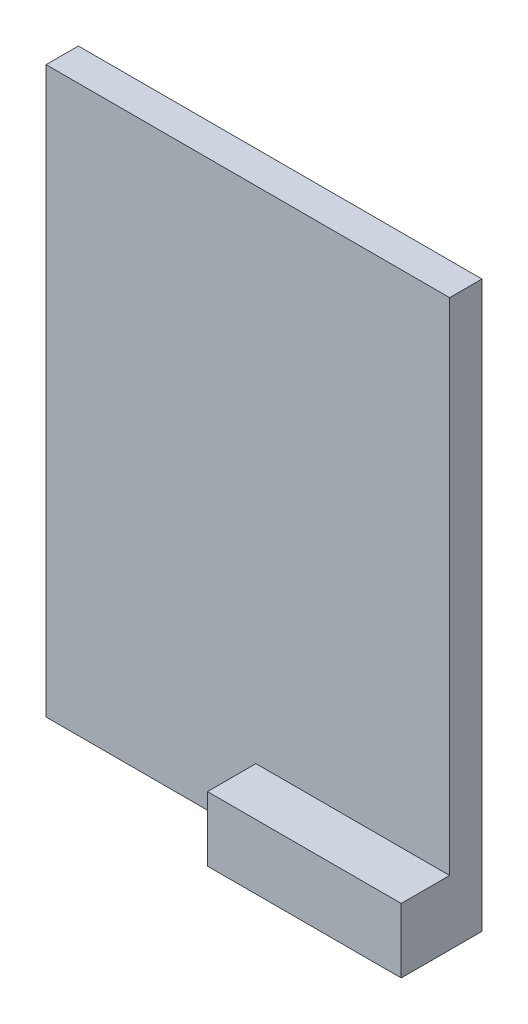
ISO-10303-21;
HEADER;
FILE_DESCRIPTION(('STEP AP214'),'2;1');
FILE_NAME('part.step','',(''),(''),'','','');
FILE_SCHEMA(('AUTOMOTIVE_DESIGN { 1 0 10303 214 1 1 1 1 }'));
ENDSEC;
DATA;
#1=APPLICATION_CONTEXT('core data for automotive mechanical design processes');
#2=APPLICATION_PROTOCOL_DEFINITION('international standard','automotive_design',2000,#1);
#3=PRODUCT_CONTEXT('',#1,'mechanical');
#4=PRODUCT('Part','Part','',(#3));
#5=PRODUCT_RELATED_PRODUCT_CATEGORY('part','',(#4));
#6=PRODUCT_DEFINITION_FORMATION('','',#4);
#7=PRODUCT_DEFINITION_CONTEXT('part definition',#1,'design');
#8=PRODUCT_DEFINITION('design','',#6,#7);
#9=PRODUCT_DEFINITION_SHAPE('','',#8);
#10=(LENGTH_UNIT() NAMED_UNIT(*) SI_UNIT(.MILLI.,.METRE.));
#11=(NAMED_UNIT(*) PLANE_ANGLE_UNIT() SI_UNIT($,.RADIAN.));
#12=(NAMED_UNIT(*) SI_UNIT($,.STERADIAN.) SOLID_ANGLE_UNIT());
#13=UNCERTAINTY_MEASURE_WITH_UNIT(LENGTH_MEASURE(1.E-05),#10,'distance_accuracy_value','');
#14=(GEOMETRIC_REPRESENTATION_CONTEXT(3) GLOBAL_UNCERTAINTY_ASSIGNED_CONTEXT((#13)) GLOBAL_UNIT_ASSIGNED_CONTEXT((#10,
#11,#12)) REPRESENTATION_CONTEXT('',''));
#15=CARTESIAN_POINT('',(0.,0.,0.));
#16=DIRECTION('',(0.,0.,1.));
#17=DIRECTION('',(1.,0.,0.));
#18=AXIS2_PLACEMENT_3D('',#15,#16,#17);
#19=CARTESIAN_POINT('',(-40.6525668835864,11.9444444444444,2.));
#20=DIRECTION('',(1.,0.,0.));
#21=DIRECTION('',(0.,1.,0.));
#22=AXIS2_PLACEMENT_3D('',#19,#20,#21);
#23=PLANE('',#22);
#24=DIRECTION('',(0.,-1.,0.));
#25=VECTOR('',#24,1.);
#26=CARTESIAN_POINT('',(-40.6525668835864,11.9444444444444,0.));
#27=LINE('',#26,#25);
#28=CARTESIAN_POINT('',(-40.6525668835864,11.9444444444444,0.));
#29=VERTEX_POINT('',#28);
#30=CARTESIAN_POINT('',(-40.6525668835864,-23.0555555555556,0.));
#31=VERTEX_POINT('',#30);
#32=EDGE_CURVE('E118',#29,#31,#27,.T.);
#33=ORIENTED_EDGE('',*,*,#32,.T.);
#34=DIRECTION('',(0.,0.,-1.));
#35=VECTOR('',#34,1.);
#36=CARTESIAN_POINT('',(-40.6525668835864,-23.0555555555556,2.));
#37=LINE('',#36,#35);
#38=CARTESIAN_POINT('',(-40.6525668835864,-23.0555555555556,2.));
#39=VERTEX_POINT('',#38);
#40=EDGE_CURVE('E11',#39,#31,#37,.T.);
#41=ORIENTED_EDGE('',*,*,#40,.F.);
#42=DIRECTION('',(0.,-1.,0.));
#43=VECTOR('',#42,1.);
#44=CARTESIAN_POINT('',(-40.6525668835864,11.9444444444444,2.));
#45=LINE('',#44,#43);
#46=CARTESIAN_POINT('',(-40.6525668835864,11.9444444444444,2.));
#47=VERTEX_POINT('',#46);
#48=EDGE_CURVE('E127',#47,#39,#45,.T.);
#49=ORIENTED_EDGE('',*,*,#48,.F.);
#50=DIRECTION('',(0.,0.,-1.));
#51=VECTOR('',#50,1.);
#52=CARTESIAN_POINT('',(-40.6525668835864,11.9444444444444,2.));
#53=LINE('',#52,#51);
#54=EDGE_CURVE('E133',#47,#29,#53,.T.);
#55=ORIENTED_EDGE('',*,*,#54,.T.);
#56=EDGE_LOOP('',(#33,#41,#49,#55));
#57=FACE_BOUND('',#56,.T.);
#58=ADVANCED_FACE('F37',(#57),#23,.F.);
#59=CARTESIAN_POINT('',(-40.6525668835864,-23.0555555555556,2.));
#60=DIRECTION('',(0.,1.,0.));
#61=DIRECTION('',(0.,0.,1.));
#62=AXIS2_PLACEMENT_3D('',#59,#60,#61);
#63=PLANE('',#62);
#64=DIRECTION('',(1.,0.,0.));
#65=VECTOR('',#64,1.);
#66=CARTESIAN_POINT('',(-40.6525668835864,-23.0555555555556,0.));
#67=LINE('',#66,#65);
#68=CARTESIAN_POINT('',(-15.6525668835864,-23.0555555555556,0.));
#69=VERTEX_POINT('',#68);
#70=EDGE_CURVE('E121',#31,#69,#67,.T.);
#71=ORIENTED_EDGE('',*,*,#70,.T.);
#72=DIRECTION('',(0.,0.,-1.));
#73=VECTOR('',#72,1.);
#74=CARTESIAN_POINT('',(-15.6525668835864,-23.0555555555556,2.));
#75=LINE('',#74,#73);
#76=CARTESIAN_POINT('',(-15.6525668835864,-23.0555555555556,5.));
#77=VERTEX_POINT('',#76);
#78=EDGE_CURVE('E44',#77,#69,#75,.T.);
#79=ORIENTED_EDGE('',*,*,#78,.F.);
#80=DIRECTION('',(1.,0.,0.));
#81=VECTOR('',#80,1.);
#82=CARTESIAN_POINT('',(-15.6525668835864,-23.0555555555556,5.));
#83=LINE('',#82,#81);
#84=CARTESIAN_POINT('',(-27.6525668835864,-23.0555555555556,5.));
#85=VERTEX_POINT('',#84);
#86=EDGE_CURVE('E110',#85,#77,#83,.T.);
#87=ORIENTED_EDGE('',*,*,#86,.F.);
#88=DIRECTION('',(0.,0.,-1.));
#89=VECTOR('',#88,1.);
#90=CARTESIAN_POINT('',(-27.6525668835864,-23.0555555555556,5.));
#91=LINE('',#90,#89);
#92=CARTESIAN_POINT('',(-27.6525668835864,-23.0555555555556,2.));
#93=VERTEX_POINT('',#92);
#94=EDGE_CURVE('E123',#85,#93,#91,.T.);
#95=ORIENTED_EDGE('',*,*,#94,.T.);
#96=DIRECTION('',(1.,0.,0.));
#97=VECTOR('',#96,1.);
#98=CARTESIAN_POINT('',(-40.6525668835864,-23.0555555555556,2.));
#99=LINE('',#98,#97);
#100=EDGE_CURVE('E57',#39,#93,#99,.T.);
#101=ORIENTED_EDGE('',*,*,#100,.F.);
#102=ORIENTED_EDGE('',*,*,#40,.T.);
#103=EDGE_LOOP('',(#71,#79,#87,#95,#101,#102));
#104=FACE_BOUND('',#103,.T.);
#105=ADVANCED_FACE('F167',(#104),#63,.F.);
#106=CARTESIAN_POINT('',(-15.6525668835864,11.9444444444444,2.));
#107=DIRECTION('',(-1.,0.,0.));
#108=DIRECTION('',(0.,0.,1.));
#109=AXIS2_PLACEMENT_3D('',#106,#107,#108);
#110=PLANE('',#109);
#111=DIRECTION('',(0.,1.,0.));
#112=VECTOR('',#111,1.);
#113=CARTESIAN_POINT('',(-15.6525668835864,11.9444444444444,0.));
#114=LINE('',#113,#112);
#115=CARTESIAN_POINT('',(-15.6525668835864,11.9444444444444,0.));
#116=VERTEX_POINT('',#115);
#117=EDGE_CURVE('E136',#69,#116,#114,.T.);
#118=ORIENTED_EDGE('',*,*,#117,.T.);
#119=DIRECTION('',(0.,0.,-1.));
#120=VECTOR('',#119,1.);
#121=CARTESIAN_POINT('',(-15.6525668835864,11.9444444444444,2.));
#122=LINE('',#121,#120);
#123=CARTESIAN_POINT('',(-15.6525668835864,11.9444444444444,2.));
#124=VERTEX_POINT('',#123);
#125=EDGE_CURVE('E141',#124,#116,#122,.T.);
#126=ORIENTED_EDGE('',*,*,#125,.F.);
#127=DIRECTION('',(0.,1.,0.));
#128=VECTOR('',#127,1.);
#129=CARTESIAN_POINT('',(-15.6525668835864,11.9444444444444,2.));
#130=LINE('',#129,#128);
#131=CARTESIAN_POINT('',(-15.6525668835864,-19.0555555555556,2.));
#132=VERTEX_POINT('',#131);
#133=EDGE_CURVE('E117',#132,#124,#130,.T.);
#134=ORIENTED_EDGE('',*,*,#133,.F.);
#135=DIRECTION('',(0.,0.,-1.));
#136=VECTOR('',#135,1.);
#137=CARTESIAN_POINT('',(-15.6525668835864,-19.0555555555556,5.));
#138=LINE('',#137,#136);
#139=CARTESIAN_POINT('',(-15.6525668835864,-19.0555555555556,5.));
#140=VERTEX_POINT('',#139);
#141=EDGE_CURVE('E98',#140,#132,#138,.T.);
#142=ORIENTED_EDGE('',*,*,#141,.F.);
#143=DIRECTION('',(0.,1.,0.));
#144=VECTOR('',#143,1.);
#145=CARTESIAN_POINT('',(-15.6525668835864,-23.0555555555556,5.));
#146=LINE('',#145,#144);
#147=EDGE_CURVE('E104',#77,#140,#146,.T.);
#148=ORIENTED_EDGE('',*,*,#147,.F.);
#149=ORIENTED_EDGE('',*,*,#78,.T.);
#150=EDGE_LOOP('',(#118,#126,#134,#142,#148,#149));
#151=FACE_BOUND('',#150,.T.);
#152=ADVANCED_FACE('F115',(#151),#110,.F.);
#153=CARTESIAN_POINT('',(-40.6525668835864,11.9444444444444,2.));
#154=DIRECTION('',(0.,-1.,0.));
#155=DIRECTION('',(0.,0.,-1.));
#156=AXIS2_PLACEMENT_3D('',#153,#154,#155);
#157=PLANE('',#156);
#158=DIRECTION('',(-1.,0.,0.));
#159=VECTOR('',#158,1.);
#160=CARTESIAN_POINT('',(-40.6525668835864,11.9444444444444,0.));
#161=LINE('',#160,#159);
#162=EDGE_CURVE('E129',#116,#29,#161,.T.);
#163=ORIENTED_EDGE('',*,*,#162,.T.);
#164=ORIENTED_EDGE('',*,*,#54,.F.);
#165=DIRECTION('',(-1.,0.,0.));
#166=VECTOR('',#165,1.);
#167=CARTESIAN_POINT('',(-40.6525668835864,11.9444444444444,2.));
#168=LINE('',#167,#166);
#169=EDGE_CURVE('E132',#124,#47,#168,.T.);
#170=ORIENTED_EDGE('',*,*,#169,.F.);
#171=ORIENTED_EDGE('',*,*,#125,.T.);
#172=EDGE_LOOP('',(#163,#164,#170,#171));
#173=FACE_BOUND('',#172,.T.);
#174=ADVANCED_FACE('F151',(#173),#157,.F.);
#175=CARTESIAN_POINT('',(0.,0.,2.));
#176=DIRECTION('',(0.,0.,1.));
#177=DIRECTION('',(1.,0.,0.));
#178=AXIS2_PLACEMENT_3D('',#175,#176,#177);
#179=PLANE('',#178);
#180=DIRECTION('',(0.,-1.,0.));
#181=VECTOR('',#180,1.);
#182=CARTESIAN_POINT('',(-27.6525668835864,-23.0555555555556,2.));
#183=LINE('',#182,#181);
#184=CARTESIAN_POINT('',(-27.6525668835864,-19.0555555555556,2.));
#185=VERTEX_POINT('',#184);
#186=EDGE_CURVE('E113',#185,#93,#183,.T.);
#187=ORIENTED_EDGE('',*,*,#186,.F.);
#188=DIRECTION('',(-1.,0.,0.));
#189=VECTOR('',#188,1.);
#190=CARTESIAN_POINT('',(-15.6525668835864,-19.0555555555556,2.));
#191=LINE('',#190,#189);
#192=EDGE_CURVE('E51',#132,#185,#191,.T.);
#193=ORIENTED_EDGE('',*,*,#192,.F.);
#194=ORIENTED_EDGE('',*,*,#133,.T.);
#195=ORIENTED_EDGE('',*,*,#169,.T.);
#196=ORIENTED_EDGE('',*,*,#48,.T.);
#197=ORIENTED_EDGE('',*,*,#100,.T.);
#198=EDGE_LOOP('',(#187,#193,#194,#195,#196,#197));
#199=FACE_BOUND('',#198,.T.);
#200=ADVANCED_FACE('F156',(#199),#179,.T.);
#201=CARTESIAN_POINT('',(0.,0.,0.));
#202=DIRECTION('',(0.,0.,1.));
#203=DIRECTION('',(1.,0.,0.));
#204=AXIS2_PLACEMENT_3D('',#201,#202,#203);
#205=PLANE('',#204);
#206=ORIENTED_EDGE('',*,*,#32,.F.);
#207=ORIENTED_EDGE('',*,*,#162,.F.);
#208=ORIENTED_EDGE('',*,*,#117,.F.);
#209=ORIENTED_EDGE('',*,*,#70,.F.);
#210=EDGE_LOOP('',(#206,#207,#208,#209));
#211=FACE_BOUND('',#210,.T.);
#212=ADVANCED_FACE('F148',(#211),#205,.F.);
#213=CARTESIAN_POINT('',(-15.6525668835864,-19.0555555555556,5.));
#214=DIRECTION('',(0.,-1.,0.));
#215=DIRECTION('',(0.,0.,-1.));
#216=AXIS2_PLACEMENT_3D('',#213,#214,#215);
#217=PLANE('',#216);
#218=ORIENTED_EDGE('',*,*,#192,.T.);
#219=DIRECTION('',(0.,0.,-1.));
#220=VECTOR('',#219,1.);
#221=CARTESIAN_POINT('',(-27.6525668835864,-19.0555555555556,5.));
#222=LINE('',#221,#220);
#223=CARTESIAN_POINT('',(-27.6525668835864,-19.0555555555556,5.));
#224=VERTEX_POINT('',#223);
#225=EDGE_CURVE('E100',#224,#185,#222,.T.);
#226=ORIENTED_EDGE('',*,*,#225,.F.);
#227=DIRECTION('',(-1.,0.,0.));
#228=VECTOR('',#227,1.);
#229=CARTESIAN_POINT('',(-15.6525668835864,-19.0555555555556,5.));
#230=LINE('',#229,#228);
#231=EDGE_CURVE('E94',#140,#224,#230,.T.);
#232=ORIENTED_EDGE('',*,*,#231,.F.);
#233=ORIENTED_EDGE('',*,*,#141,.T.);
#234=EDGE_LOOP('',(#218,#226,#232,#233));
#235=FACE_BOUND('',#234,.T.);
#236=ADVANCED_FACE('F96',(#235),#217,.F.);
#237=CARTESIAN_POINT('',(-27.6525668835864,-23.0555555555556,5.));
#238=DIRECTION('',(1.,0.,0.));
#239=DIRECTION('',(0.,0.,-1.));
#240=AXIS2_PLACEMENT_3D('',#237,#238,#239);
#241=PLANE('',#240);
#242=ORIENTED_EDGE('',*,*,#186,.T.);
#243=ORIENTED_EDGE('',*,*,#94,.F.);
#244=DIRECTION('',(0.,-1.,0.));
#245=VECTOR('',#244,1.);
#246=CARTESIAN_POINT('',(-27.6525668835864,-23.0555555555556,5.));
#247=LINE('',#246,#245);
#248=EDGE_CURVE('E103',#224,#85,#247,.T.);
#249=ORIENTED_EDGE('',*,*,#248,.F.);
#250=ORIENTED_EDGE('',*,*,#225,.T.);
#251=EDGE_LOOP('',(#242,#243,#249,#250));
#252=FACE_BOUND('',#251,.T.);
#253=ADVANCED_FACE('F182',(#252),#241,.F.);
#254=CARTESIAN_POINT('',(0.,0.,5.));
#255=DIRECTION('',(0.,0.,1.));
#256=DIRECTION('',(1.,0.,0.));
#257=AXIS2_PLACEMENT_3D('',#254,#255,#256);
#258=PLANE('',#257);
#259=ORIENTED_EDGE('',*,*,#147,.T.);
#260=ORIENTED_EDGE('',*,*,#231,.T.);
#261=ORIENTED_EDGE('',*,*,#248,.T.);
#262=ORIENTED_EDGE('',*,*,#86,.T.);
#263=EDGE_LOOP('',(#259,#260,#261,#262));
#264=FACE_BOUND('',#263,.T.);
#265=ADVANCED_FACE('F108',(#264),#258,.T.);
#266=CLOSED_SHELL('',(#58,#105,#152,#174,#200,#212,#236,#253,#265));
#267=MANIFOLD_SOLID_BREP('B2',#266);
#268=ADVANCED_BREP_SHAPE_REPRESENTATION('',(#18,#267),#14);
#269=SHAPE_DEFINITION_REPRESENTATION(#9,#268);
ENDSEC;
END-ISO-10303-21;
